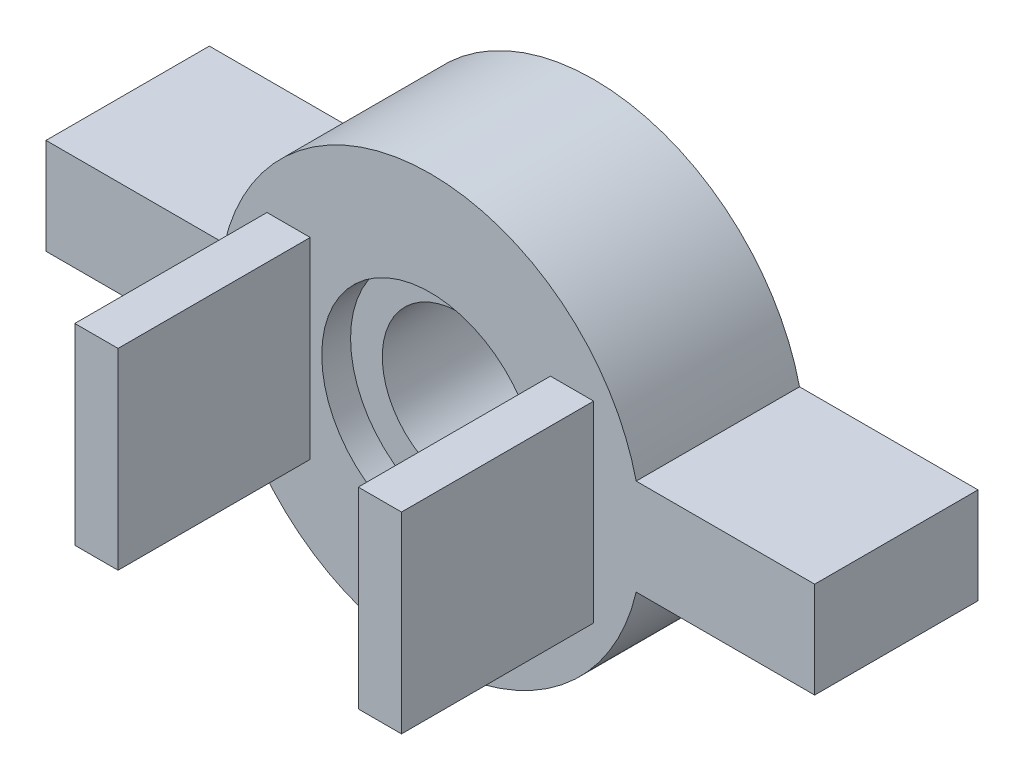
ISO-10303-21;
HEADER;
FILE_DESCRIPTION(('STEP AP214'),'2;1');
FILE_NAME('part.step','',(''),(''),'','','');
FILE_SCHEMA(('AUTOMOTIVE_DESIGN { 1 0 10303 214 1 1 1 1 }'));
ENDSEC;
DATA;
#1=APPLICATION_CONTEXT('core data for automotive mechanical design processes');
#2=APPLICATION_PROTOCOL_DEFINITION('international standard','automotive_design',2000,#1);
#3=PRODUCT_CONTEXT('',#1,'mechanical');
#4=PRODUCT('Part','Part','',(#3));
#5=PRODUCT_RELATED_PRODUCT_CATEGORY('part','',(#4));
#6=PRODUCT_DEFINITION_FORMATION('','',#4);
#7=PRODUCT_DEFINITION_CONTEXT('part definition',#1,'design');
#8=PRODUCT_DEFINITION('design','',#6,#7);
#9=PRODUCT_DEFINITION_SHAPE('','',#8);
#10=(LENGTH_UNIT() NAMED_UNIT(*) SI_UNIT(.MILLI.,.METRE.));
#11=(NAMED_UNIT(*) PLANE_ANGLE_UNIT() SI_UNIT($,.RADIAN.));
#12=(NAMED_UNIT(*) SI_UNIT($,.STERADIAN.) SOLID_ANGLE_UNIT());
#13=UNCERTAINTY_MEASURE_WITH_UNIT(LENGTH_MEASURE(1.E-05),#10,'distance_accuracy_value','');
#14=(GEOMETRIC_REPRESENTATION_CONTEXT(3) GLOBAL_UNCERTAINTY_ASSIGNED_CONTEXT((#13)) GLOBAL_UNIT_ASSIGNED_CONTEXT((#10,
#11,#12)) REPRESENTATION_CONTEXT('',''));
#15=CARTESIAN_POINT('',(0.,0.,0.));
#16=DIRECTION('',(0.,0.,1.));
#17=DIRECTION('',(1.,0.,0.));
#18=AXIS2_PLACEMENT_3D('',#15,#16,#17);
#19=CARTESIAN_POINT('',(0.,0.,-0.000999999999999265));
#20=DIRECTION('',(0.,0.,1.));
#21=DIRECTION('',(1.,0.,0.));
#22=AXIS2_PLACEMENT_3D('',#19,#20,#21);
#23=CYLINDRICAL_SURFACE('',#22,4.);
#24=CARTESIAN_POINT('',(0.,0.,0.));
#25=DIRECTION('',(0.,0.,1.));
#26=DIRECTION('',(1.,0.,0.));
#27=AXIS2_PLACEMENT_3D('',#24,#25,#26);
#28=CIRCLE('',#27,4.);
#29=CARTESIAN_POINT('',(4.,0.,0.));
#30=VERTEX_POINT('',#29);
#31=EDGE_CURVE('E204',#30,#30,#28,.F.);
#32=ORIENTED_EDGE('',*,*,#31,.T.);
#33=EDGE_LOOP('',(#32));
#34=FACE_BOUND('',#33,.T.);
#35=CARTESIAN_POINT('',(0.,0.,7.));
#36=DIRECTION('',(0.,0.,1.));
#37=DIRECTION('',(1.,0.,0.));
#38=AXIS2_PLACEMENT_3D('',#35,#36,#37);
#39=CIRCLE('',#38,4.);
#40=CARTESIAN_POINT('',(4.,0.,7.));
#41=VERTEX_POINT('',#40);
#42=EDGE_CURVE('E37',#41,#41,#39,.F.);
#43=ORIENTED_EDGE('',*,*,#42,.F.);
#44=EDGE_LOOP('',(#43));
#45=FACE_BOUND('',#44,.T.);
#46=ADVANCED_FACE('F33',(#34,#45),#23,.F.);
#47=CARTESIAN_POINT('',(0.,0.,8.5));
#48=DIRECTION('',(0.,0.,1.));
#49=DIRECTION('',(1.,0.,0.));
#50=AXIS2_PLACEMENT_3D('',#47,#48,#49);
#51=PLANE('',#50);
#52=CARTESIAN_POINT('',(0.,0.,8.5));
#53=DIRECTION('',(0.,0.,1.));
#54=DIRECTION('',(1.,0.,0.));
#55=AXIS2_PLACEMENT_3D('',#52,#53,#54);
#56=CIRCLE('',#55,5.65);
#57=CARTESIAN_POINT('',(5.65,0.,8.5));
#58=VERTEX_POINT('',#57);
#59=EDGE_CURVE('E510',#58,#58,#56,.T.);
#60=ORIENTED_EDGE('',*,*,#59,.F.);
#61=EDGE_LOOP('',(#60));
#62=FACE_BOUND('',#61,.T.);
#63=CARTESIAN_POINT('',(0.,0.,8.5));
#64=DIRECTION('',(0.,0.,1.));
#65=DIRECTION('',(1.,0.,0.));
#66=AXIS2_PLACEMENT_3D('',#63,#64,#65);
#67=CIRCLE('',#66,11.);
#68=CARTESIAN_POINT('',(10.7121426428143,2.5,8.5));
#69=VERTEX_POINT('',#68);
#70=CARTESIAN_POINT('',(-10.7121426428143,2.5,8.5));
#71=VERTEX_POINT('',#70);
#72=EDGE_CURVE('E208',#69,#71,#67,.T.);
#73=ORIENTED_EDGE('',*,*,#72,.T.);
#74=DIRECTION('',(-1.,0.,0.));
#75=VECTOR('',#74,1.);
#76=CARTESIAN_POINT('',(-20.,2.5,8.5));
#77=LINE('',#76,#75);
#78=CARTESIAN_POINT('',(-20.,2.5,8.5));
#79=VERTEX_POINT('',#78);
#80=EDGE_CURVE('E211',#71,#79,#77,.T.);
#81=ORIENTED_EDGE('',*,*,#80,.T.);
#82=DIRECTION('',(0.,-1.,0.));
#83=VECTOR('',#82,1.);
#84=CARTESIAN_POINT('',(-20.,2.5,8.5));
#85=LINE('',#84,#83);
#86=CARTESIAN_POINT('',(-20.,-2.5,8.5));
#87=VERTEX_POINT('',#86);
#88=EDGE_CURVE('E214',#79,#87,#85,.T.);
#89=ORIENTED_EDGE('',*,*,#88,.T.);
#90=DIRECTION('',(1.,0.,0.));
#91=VECTOR('',#90,1.);
#92=CARTESIAN_POINT('',(-20.,-2.5,8.5));
#93=LINE('',#92,#91);
#94=CARTESIAN_POINT('',(-10.7121426428143,-2.5,8.5));
#95=VERTEX_POINT('',#94);
#96=EDGE_CURVE('E216',#87,#95,#93,.T.);
#97=ORIENTED_EDGE('',*,*,#96,.T.);
#98=CARTESIAN_POINT('',(0.,0.,8.5));
#99=DIRECTION('',(0.,0.,1.));
#100=DIRECTION('',(1.,0.,0.));
#101=AXIS2_PLACEMENT_3D('',#98,#99,#100);
#102=CIRCLE('',#101,11.);
#103=CARTESIAN_POINT('',(10.7121426428143,-2.50000000000001,8.5));
#104=VERTEX_POINT('',#103);
#105=EDGE_CURVE('E218',#95,#104,#102,.T.);
#106=ORIENTED_EDGE('',*,*,#105,.T.);
#107=DIRECTION('',(1.,0.,0.));
#108=VECTOR('',#107,1.);
#109=CARTESIAN_POINT('',(10.7121426428143,-2.5,8.5));
#110=LINE('',#109,#108);
#111=CARTESIAN_POINT('',(20.,-2.5,8.5));
#112=VERTEX_POINT('',#111);
#113=EDGE_CURVE('E220',#104,#112,#110,.T.);
#114=ORIENTED_EDGE('',*,*,#113,.T.);
#115=DIRECTION('',(0.,1.,0.));
#116=VECTOR('',#115,1.);
#117=CARTESIAN_POINT('',(20.,2.5,8.5));
#118=LINE('',#117,#116);
#119=CARTESIAN_POINT('',(20.,2.5,8.5));
#120=VERTEX_POINT('',#119);
#121=EDGE_CURVE('E222',#112,#120,#118,.T.);
#122=ORIENTED_EDGE('',*,*,#121,.T.);
#123=DIRECTION('',(-1.,0.,0.));
#124=VECTOR('',#123,1.);
#125=CARTESIAN_POINT('',(10.7121426428143,2.5,8.5));
#126=LINE('',#125,#124);
#127=EDGE_CURVE('E224',#120,#69,#126,.T.);
#128=ORIENTED_EDGE('',*,*,#127,.T.);
#129=EDGE_LOOP('',(#73,#81,#89,#97,#106,#114,#122,#128));
#130=FACE_BOUND('',#129,.T.);
#131=DIRECTION('',(1.,0.,0.));
#132=VECTOR('',#131,1.);
#133=CARTESIAN_POINT('',(6.25,-5.,8.5));
#134=LINE('',#133,#132);
#135=CARTESIAN_POINT('',(6.25,-5.,8.5));
#136=VERTEX_POINT('',#135);
#137=CARTESIAN_POINT('',(8.5,-5.,8.5));
#138=VERTEX_POINT('',#137);
#139=EDGE_CURVE('E176',#136,#138,#134,.T.);
#140=ORIENTED_EDGE('',*,*,#139,.F.);
#141=DIRECTION('',(0.,-1.,0.));
#142=VECTOR('',#141,1.);
#143=CARTESIAN_POINT('',(6.25,-5.,8.5));
#144=LINE('',#143,#142);
#145=CARTESIAN_POINT('',(6.25,5.,8.5));
#146=VERTEX_POINT('',#145);
#147=EDGE_CURVE('E173',#146,#136,#144,.T.);
#148=ORIENTED_EDGE('',*,*,#147,.F.);
#149=DIRECTION('',(-1.,0.,0.));
#150=VECTOR('',#149,1.);
#151=CARTESIAN_POINT('',(6.25,5.,8.5));
#152=LINE('',#151,#150);
#153=CARTESIAN_POINT('',(8.5,5.,8.5));
#154=VERTEX_POINT('',#153);
#155=EDGE_CURVE('E185',#154,#146,#152,.T.);
#156=ORIENTED_EDGE('',*,*,#155,.F.);
#157=DIRECTION('',(0.,1.,0.));
#158=VECTOR('',#157,1.);
#159=CARTESIAN_POINT('',(8.5,5.,8.5));
#160=LINE('',#159,#158);
#161=EDGE_CURVE('E193',#138,#154,#160,.T.);
#162=ORIENTED_EDGE('',*,*,#161,.F.);
#163=EDGE_LOOP('',(#140,#148,#156,#162));
#164=FACE_BOUND('',#163,.T.);
#165=DIRECTION('',(0.,1.,0.));
#166=VECTOR('',#165,1.);
#167=CARTESIAN_POINT('',(-6.25,-5.,8.5));
#168=LINE('',#167,#166);
#169=CARTESIAN_POINT('',(-6.25,-5.,8.5));
#170=VERTEX_POINT('',#169);
#171=CARTESIAN_POINT('',(-6.25,5.,8.5));
#172=VERTEX_POINT('',#171);
#173=EDGE_CURVE('E518',#170,#172,#168,.T.);
#174=ORIENTED_EDGE('',*,*,#173,.F.);
#175=DIRECTION('',(1.,0.,0.));
#176=VECTOR('',#175,1.);
#177=CARTESIAN_POINT('',(-8.5,-5.,8.5));
#178=LINE('',#177,#176);
#179=CARTESIAN_POINT('',(-8.5,-5.,8.5));
#180=VERTEX_POINT('',#179);
#181=EDGE_CURVE('E171',#180,#170,#178,.T.);
#182=ORIENTED_EDGE('',*,*,#181,.F.);
#183=DIRECTION('',(0.,-1.,0.));
#184=VECTOR('',#183,1.);
#185=CARTESIAN_POINT('',(-8.5,5.,8.5));
#186=LINE('',#185,#184);
#187=CARTESIAN_POINT('',(-8.5,5.,8.5));
#188=VERTEX_POINT('',#187);
#189=EDGE_CURVE('E167',#188,#180,#186,.T.);
#190=ORIENTED_EDGE('',*,*,#189,.F.);
#191=DIRECTION('',(-1.,0.,0.));
#192=VECTOR('',#191,1.);
#193=CARTESIAN_POINT('',(-8.5,5.,8.5));
#194=LINE('',#193,#192);
#195=EDGE_CURVE('E520',#172,#188,#194,.T.);
#196=ORIENTED_EDGE('',*,*,#195,.F.);
#197=EDGE_LOOP('',(#174,#182,#190,#196));
#198=FACE_BOUND('',#197,.T.);
#199=ADVANCED_FACE('F283',(#62,#130,#164,#198),#51,.T.);
#200=CARTESIAN_POINT('',(0.,0.,8.5));
#201=DIRECTION('',(0.,0.,-1.));
#202=DIRECTION('',(-1.,0.,0.));
#203=AXIS2_PLACEMENT_3D('',#200,#201,#202);
#204=CYLINDRICAL_SURFACE('',#203,11.);
#205=CARTESIAN_POINT('',(0.,0.,0.));
#206=DIRECTION('',(0.,0.,1.));
#207=DIRECTION('',(1.,0.,0.));
#208=AXIS2_PLACEMENT_3D('',#205,#206,#207);
#209=CIRCLE('',#208,11.);
#210=CARTESIAN_POINT('',(10.7121426428143,2.5,0.));
#211=VERTEX_POINT('',#210);
#212=CARTESIAN_POINT('',(-10.7121426428143,2.5,0.));
#213=VERTEX_POINT('',#212);
#214=EDGE_CURVE('E207',#211,#213,#209,.T.);
#215=ORIENTED_EDGE('',*,*,#214,.T.);
#216=DIRECTION('',(0.,0.,-1.));
#217=VECTOR('',#216,1.);
#218=CARTESIAN_POINT('',(-10.7121426428143,2.5,8.5));
#219=LINE('',#218,#217);
#220=EDGE_CURVE('E11',#71,#213,#219,.T.);
#221=ORIENTED_EDGE('',*,*,#220,.F.);
#222=ORIENTED_EDGE('',*,*,#72,.F.);
#223=DIRECTION('',(0.,0.,-1.));
#224=VECTOR('',#223,1.);
#225=CARTESIAN_POINT('',(10.7121426428143,2.5,8.5));
#226=LINE('',#225,#224);
#227=EDGE_CURVE('E226',#69,#211,#226,.T.);
#228=ORIENTED_EDGE('',*,*,#227,.T.);
#229=EDGE_LOOP('',(#215,#221,#222,#228));
#230=FACE_BOUND('',#229,.T.);
#231=ADVANCED_FACE('F35',(#230),#204,.T.);
#232=CARTESIAN_POINT('',(-20.,2.5,8.5));
#233=DIRECTION('',(0.,-1.,0.));
#234=DIRECTION('',(0.,0.,-1.));
#235=AXIS2_PLACEMENT_3D('',#232,#233,#234);
#236=PLANE('',#235);
#237=DIRECTION('',(-1.,0.,0.));
#238=VECTOR('',#237,1.);
#239=CARTESIAN_POINT('',(-20.,2.5,0.));
#240=LINE('',#239,#238);
#241=CARTESIAN_POINT('',(-20.,2.5,0.));
#242=VERTEX_POINT('',#241);
#243=EDGE_CURVE('E229',#213,#242,#240,.T.);
#244=ORIENTED_EDGE('',*,*,#243,.T.);
#245=DIRECTION('',(0.,0.,-1.));
#246=VECTOR('',#245,1.);
#247=CARTESIAN_POINT('',(-20.,2.5,8.5));
#248=LINE('',#247,#246);
#249=EDGE_CURVE('E42',#79,#242,#248,.T.);
#250=ORIENTED_EDGE('',*,*,#249,.F.);
#251=ORIENTED_EDGE('',*,*,#80,.F.);
#252=ORIENTED_EDGE('',*,*,#220,.T.);
#253=EDGE_LOOP('',(#244,#250,#251,#252));
#254=FACE_BOUND('',#253,.T.);
#255=ADVANCED_FACE('F288',(#254),#236,.F.);
#256=CARTESIAN_POINT('',(-20.,2.5,8.5));
#257=DIRECTION('',(1.,0.,0.));
#258=DIRECTION('',(0.,0.,-1.));
#259=AXIS2_PLACEMENT_3D('',#256,#257,#258);
#260=PLANE('',#259);
#261=DIRECTION('',(0.,-1.,0.));
#262=VECTOR('',#261,1.);
#263=CARTESIAN_POINT('',(-20.,2.5,0.));
#264=LINE('',#263,#262);
#265=CARTESIAN_POINT('',(-20.,-2.5,0.));
#266=VERTEX_POINT('',#265);
#267=EDGE_CURVE('E231',#242,#266,#264,.T.);
#268=ORIENTED_EDGE('',*,*,#267,.T.);
#269=DIRECTION('',(0.,0.,-1.));
#270=VECTOR('',#269,1.);
#271=CARTESIAN_POINT('',(-20.,-2.5,8.5));
#272=LINE('',#271,#270);
#273=EDGE_CURVE('E256',#87,#266,#272,.T.);
#274=ORIENTED_EDGE('',*,*,#273,.F.);
#275=ORIENTED_EDGE('',*,*,#88,.F.);
#276=ORIENTED_EDGE('',*,*,#249,.T.);
#277=EDGE_LOOP('',(#268,#274,#275,#276));
#278=FACE_BOUND('',#277,.T.);
#279=ADVANCED_FACE('F264',(#278),#260,.F.);
#280=CARTESIAN_POINT('',(-20.,-2.5,8.5));
#281=DIRECTION('',(0.,1.,0.));
#282=DIRECTION('',(0.,0.,1.));
#283=AXIS2_PLACEMENT_3D('',#280,#281,#282);
#284=PLANE('',#283);
#285=DIRECTION('',(1.,0.,0.));
#286=VECTOR('',#285,1.);
#287=CARTESIAN_POINT('',(-20.,-2.5,0.));
#288=LINE('',#287,#286);
#289=CARTESIAN_POINT('',(-10.7121426428143,-2.5,0.));
#290=VERTEX_POINT('',#289);
#291=EDGE_CURVE('E233',#266,#290,#288,.T.);
#292=ORIENTED_EDGE('',*,*,#291,.T.);
#293=DIRECTION('',(0.,0.,-1.));
#294=VECTOR('',#293,1.);
#295=CARTESIAN_POINT('',(-10.7121426428143,-2.5,8.5));
#296=LINE('',#295,#294);
#297=EDGE_CURVE('E253',#95,#290,#296,.T.);
#298=ORIENTED_EDGE('',*,*,#297,.F.);
#299=ORIENTED_EDGE('',*,*,#96,.F.);
#300=ORIENTED_EDGE('',*,*,#273,.T.);
#301=EDGE_LOOP('',(#292,#298,#299,#300));
#302=FACE_BOUND('',#301,.T.);
#303=ADVANCED_FACE('F275',(#302),#284,.F.);
#304=CARTESIAN_POINT('',(0.,0.,8.5));
#305=DIRECTION('',(0.,0.,-1.));
#306=DIRECTION('',(-1.,0.,0.));
#307=AXIS2_PLACEMENT_3D('',#304,#305,#306);
#308=CYLINDRICAL_SURFACE('',#307,11.);
#309=CARTESIAN_POINT('',(0.,0.,0.));
#310=DIRECTION('',(0.,0.,1.));
#311=DIRECTION('',(1.,0.,0.));
#312=AXIS2_PLACEMENT_3D('',#309,#310,#311);
#313=CIRCLE('',#312,11.);
#314=CARTESIAN_POINT('',(10.7121426428143,-2.50000000000001,0.));
#315=VERTEX_POINT('',#314);
#316=EDGE_CURVE('E235',#290,#315,#313,.T.);
#317=ORIENTED_EDGE('',*,*,#316,.T.);
#318=DIRECTION('',(0.,0.,-1.));
#319=VECTOR('',#318,1.);
#320=CARTESIAN_POINT('',(10.7121426428143,-2.50000000000001,8.5));
#321=LINE('',#320,#319);
#322=EDGE_CURVE('E250',#104,#315,#321,.T.);
#323=ORIENTED_EDGE('',*,*,#322,.F.);
#324=ORIENTED_EDGE('',*,*,#105,.F.);
#325=ORIENTED_EDGE('',*,*,#297,.T.);
#326=EDGE_LOOP('',(#317,#323,#324,#325));
#327=FACE_BOUND('',#326,.T.);
#328=ADVANCED_FACE('F279',(#327),#308,.T.);
#329=CARTESIAN_POINT('',(10.7121426428143,-2.5,8.5));
#330=DIRECTION('',(0.,1.,0.));
#331=DIRECTION('',(0.,0.,1.));
#332=AXIS2_PLACEMENT_3D('',#329,#330,#331);
#333=PLANE('',#332);
#334=DIRECTION('',(1.,0.,0.));
#335=VECTOR('',#334,1.);
#336=CARTESIAN_POINT('',(10.7121426428143,-2.5,0.));
#337=LINE('',#336,#335);
#338=CARTESIAN_POINT('',(20.,-2.5,0.));
#339=VERTEX_POINT('',#338);
#340=EDGE_CURVE('E237',#315,#339,#337,.T.);
#341=ORIENTED_EDGE('',*,*,#340,.T.);
#342=DIRECTION('',(0.,0.,-1.));
#343=VECTOR('',#342,1.);
#344=CARTESIAN_POINT('',(20.,-2.5,8.5));
#345=LINE('',#344,#343);
#346=EDGE_CURVE('E247',#112,#339,#345,.T.);
#347=ORIENTED_EDGE('',*,*,#346,.F.);
#348=ORIENTED_EDGE('',*,*,#113,.F.);
#349=ORIENTED_EDGE('',*,*,#322,.T.);
#350=EDGE_LOOP('',(#341,#347,#348,#349));
#351=FACE_BOUND('',#350,.T.);
#352=ADVANCED_FACE('F301',(#351),#333,.F.);
#353=CARTESIAN_POINT('',(20.,2.5,8.5));
#354=DIRECTION('',(-1.,0.,0.));
#355=DIRECTION('',(0.,0.,1.));
#356=AXIS2_PLACEMENT_3D('',#353,#354,#355);
#357=PLANE('',#356);
#358=DIRECTION('',(0.,1.,0.));
#359=VECTOR('',#358,1.);
#360=CARTESIAN_POINT('',(20.,2.5,0.));
#361=LINE('',#360,#359);
#362=CARTESIAN_POINT('',(20.,2.5,0.));
#363=VERTEX_POINT('',#362);
#364=EDGE_CURVE('E239',#339,#363,#361,.T.);
#365=ORIENTED_EDGE('',*,*,#364,.T.);
#366=DIRECTION('',(0.,0.,-1.));
#367=VECTOR('',#366,1.);
#368=CARTESIAN_POINT('',(20.,2.5,8.5));
#369=LINE('',#368,#367);
#370=EDGE_CURVE('E244',#120,#363,#369,.T.);
#371=ORIENTED_EDGE('',*,*,#370,.F.);
#372=ORIENTED_EDGE('',*,*,#121,.F.);
#373=ORIENTED_EDGE('',*,*,#346,.T.);
#374=EDGE_LOOP('',(#365,#371,#372,#373));
#375=FACE_BOUND('',#374,.T.);
#376=ADVANCED_FACE('F299',(#375),#357,.F.);
#377=CARTESIAN_POINT('',(10.7121426428143,2.5,8.5));
#378=DIRECTION('',(0.,-1.,0.));
#379=DIRECTION('',(0.,0.,-1.));
#380=AXIS2_PLACEMENT_3D('',#377,#378,#379);
#381=PLANE('',#380);
#382=DIRECTION('',(-1.,0.,0.));
#383=VECTOR('',#382,1.);
#384=CARTESIAN_POINT('',(10.7121426428143,2.5,0.));
#385=LINE('',#384,#383);
#386=EDGE_CURVE('E212',#363,#211,#385,.T.);
#387=ORIENTED_EDGE('',*,*,#386,.T.);
#388=ORIENTED_EDGE('',*,*,#227,.F.);
#389=ORIENTED_EDGE('',*,*,#127,.F.);
#390=ORIENTED_EDGE('',*,*,#370,.T.);
#391=EDGE_LOOP('',(#387,#388,#389,#390));
#392=FACE_BOUND('',#391,.T.);
#393=ADVANCED_FACE('F294',(#392),#381,.F.);
#394=CARTESIAN_POINT('',(0.,0.,0.));
#395=DIRECTION('',(0.,0.,1.));
#396=DIRECTION('',(1.,0.,0.));
#397=AXIS2_PLACEMENT_3D('',#394,#395,#396);
#398=PLANE('',#397);
#399=ORIENTED_EDGE('',*,*,#31,.F.);
#400=EDGE_LOOP('',(#399));
#401=FACE_BOUND('',#400,.T.);
#402=ORIENTED_EDGE('',*,*,#214,.F.);
#403=ORIENTED_EDGE('',*,*,#386,.F.);
#404=ORIENTED_EDGE('',*,*,#364,.F.);
#405=ORIENTED_EDGE('',*,*,#340,.F.);
#406=ORIENTED_EDGE('',*,*,#316,.F.);
#407=ORIENTED_EDGE('',*,*,#291,.F.);
#408=ORIENTED_EDGE('',*,*,#267,.F.);
#409=ORIENTED_EDGE('',*,*,#243,.F.);
#410=EDGE_LOOP('',(#402,#403,#404,#405,#406,#407,#408,#409));
#411=FACE_BOUND('',#410,.T.);
#412=ADVANCED_FACE('F270',(#401,#411),#398,.F.);
#413=CARTESIAN_POINT('',(6.25,-5.,18.5));
#414=DIRECTION('',(1.,0.,0.));
#415=DIRECTION('',(0.,0.,-1.));
#416=AXIS2_PLACEMENT_3D('',#413,#414,#415);
#417=PLANE('',#416);
#418=ORIENTED_EDGE('',*,*,#147,.T.);
#419=DIRECTION('',(0.,0.,-1.));
#420=VECTOR('',#419,1.);
#421=CARTESIAN_POINT('',(6.25,-5.,18.5));
#422=LINE('',#421,#420);
#423=CARTESIAN_POINT('',(6.25,-5.,18.5));
#424=VERTEX_POINT('',#423);
#425=EDGE_CURVE('E202',#424,#136,#422,.T.);
#426=ORIENTED_EDGE('',*,*,#425,.F.);
#427=DIRECTION('',(0.,-1.,0.));
#428=VECTOR('',#427,1.);
#429=CARTESIAN_POINT('',(6.25,-5.,18.5));
#430=LINE('',#429,#428);
#431=CARTESIAN_POINT('',(6.25,5.,18.5));
#432=VERTEX_POINT('',#431);
#433=EDGE_CURVE('E181',#432,#424,#430,.T.);
#434=ORIENTED_EDGE('',*,*,#433,.F.);
#435=DIRECTION('',(0.,0.,-1.));
#436=VECTOR('',#435,1.);
#437=CARTESIAN_POINT('',(6.25,5.,18.5));
#438=LINE('',#437,#436);
#439=EDGE_CURVE('E190',#432,#146,#438,.T.);
#440=ORIENTED_EDGE('',*,*,#439,.T.);
#441=EDGE_LOOP('',(#418,#426,#434,#440));
#442=FACE_BOUND('',#441,.T.);
#443=ADVANCED_FACE('F320',(#442),#417,.F.);
#444=CARTESIAN_POINT('',(6.25,-5.,18.5));
#445=DIRECTION('',(0.,1.,0.));
#446=DIRECTION('',(0.,0.,1.));
#447=AXIS2_PLACEMENT_3D('',#444,#445,#446);
#448=PLANE('',#447);
#449=ORIENTED_EDGE('',*,*,#139,.T.);
#450=DIRECTION('',(0.,0.,-1.));
#451=VECTOR('',#450,1.);
#452=CARTESIAN_POINT('',(8.5,-5.,18.5));
#453=LINE('',#452,#451);
#454=CARTESIAN_POINT('',(8.5,-5.,18.5));
#455=VERTEX_POINT('',#454);
#456=EDGE_CURVE('E199',#455,#138,#453,.T.);
#457=ORIENTED_EDGE('',*,*,#456,.F.);
#458=DIRECTION('',(1.,0.,0.));
#459=VECTOR('',#458,1.);
#460=CARTESIAN_POINT('',(6.25,-5.,18.5));
#461=LINE('',#460,#459);
#462=EDGE_CURVE('E184',#424,#455,#461,.T.);
#463=ORIENTED_EDGE('',*,*,#462,.F.);
#464=ORIENTED_EDGE('',*,*,#425,.T.);
#465=EDGE_LOOP('',(#449,#457,#463,#464));
#466=FACE_BOUND('',#465,.T.);
#467=ADVANCED_FACE('F341',(#466),#448,.F.);
#468=CARTESIAN_POINT('',(8.5,5.,18.5));
#469=DIRECTION('',(-1.,0.,0.));
#470=DIRECTION('',(0.,0.,1.));
#471=AXIS2_PLACEMENT_3D('',#468,#469,#470);
#472=PLANE('',#471);
#473=ORIENTED_EDGE('',*,*,#161,.T.);
#474=DIRECTION('',(0.,0.,-1.));
#475=VECTOR('',#474,1.);
#476=CARTESIAN_POINT('',(8.5,5.,18.5));
#477=LINE('',#476,#475);
#478=CARTESIAN_POINT('',(8.5,5.,18.5));
#479=VERTEX_POINT('',#478);
#480=EDGE_CURVE('E57',#479,#154,#477,.T.);
#481=ORIENTED_EDGE('',*,*,#480,.F.);
#482=DIRECTION('',(0.,1.,0.));
#483=VECTOR('',#482,1.);
#484=CARTESIAN_POINT('',(8.5,5.,18.5));
#485=LINE('',#484,#483);
#486=EDGE_CURVE('E187',#455,#479,#485,.T.);
#487=ORIENTED_EDGE('',*,*,#486,.F.);
#488=ORIENTED_EDGE('',*,*,#456,.T.);
#489=EDGE_LOOP('',(#473,#481,#487,#488));
#490=FACE_BOUND('',#489,.T.);
#491=ADVANCED_FACE('F348',(#490),#472,.F.);
#492=CARTESIAN_POINT('',(6.25,5.,18.5));
#493=DIRECTION('',(0.,-1.,0.));
#494=DIRECTION('',(0.,0.,-1.));
#495=AXIS2_PLACEMENT_3D('',#492,#493,#494);
#496=PLANE('',#495);
#497=ORIENTED_EDGE('',*,*,#155,.T.);
#498=ORIENTED_EDGE('',*,*,#439,.F.);
#499=DIRECTION('',(-1.,0.,0.));
#500=VECTOR('',#499,1.);
#501=CARTESIAN_POINT('',(6.25,5.,18.5));
#502=LINE('',#501,#500);
#503=EDGE_CURVE('E189',#479,#432,#502,.T.);
#504=ORIENTED_EDGE('',*,*,#503,.F.);
#505=ORIENTED_EDGE('',*,*,#480,.T.);
#506=EDGE_LOOP('',(#497,#498,#504,#505));
#507=FACE_BOUND('',#506,.T.);
#508=ADVANCED_FACE('F355',(#507),#496,.F.);
#509=CARTESIAN_POINT('',(0.,0.,18.5));
#510=DIRECTION('',(0.,0.,-1.));
#511=DIRECTION('',(-1.,0.,0.));
#512=AXIS2_PLACEMENT_3D('',#509,#510,#511);
#513=PLANE('',#512);
#514=ORIENTED_EDGE('',*,*,#433,.T.);
#515=ORIENTED_EDGE('',*,*,#462,.T.);
#516=ORIENTED_EDGE('',*,*,#486,.T.);
#517=ORIENTED_EDGE('',*,*,#503,.T.);
#518=EDGE_LOOP('',(#514,#515,#516,#517));
#519=FACE_BOUND('',#518,.T.);
#520=ADVANCED_FACE('F363',(#519),#513,.F.);
#521=CARTESIAN_POINT('',(-8.5,-5.,18.5));
#522=DIRECTION('',(0.,1.,0.));
#523=DIRECTION('',(0.,0.,1.));
#524=AXIS2_PLACEMENT_3D('',#521,#522,#523);
#525=PLANE('',#524);
#526=ORIENTED_EDGE('',*,*,#181,.T.);
#527=DIRECTION('',(0.,0.,-1.));
#528=VECTOR('',#527,1.);
#529=CARTESIAN_POINT('',(-6.25,-5.,18.5));
#530=LINE('',#529,#528);
#531=CARTESIAN_POINT('',(-6.25,-5.,18.5));
#532=VERTEX_POINT('',#531);
#533=EDGE_CURVE('E152',#532,#170,#530,.T.);
#534=ORIENTED_EDGE('',*,*,#533,.F.);
#535=DIRECTION('',(1.,0.,0.));
#536=VECTOR('',#535,1.);
#537=CARTESIAN_POINT('',(-8.5,-5.,18.5));
#538=LINE('',#537,#536);
#539=CARTESIAN_POINT('',(-8.5,-5.,18.5));
#540=VERTEX_POINT('',#539);
#541=EDGE_CURVE('E159',#540,#532,#538,.T.);
#542=ORIENTED_EDGE('',*,*,#541,.F.);
#543=DIRECTION('',(0.,0.,-1.));
#544=VECTOR('',#543,1.);
#545=CARTESIAN_POINT('',(-8.5,-5.,18.5));
#546=LINE('',#545,#544);
#547=EDGE_CURVE('E516',#540,#180,#546,.T.);
#548=ORIENTED_EDGE('',*,*,#547,.T.);
#549=EDGE_LOOP('',(#526,#534,#542,#548));
#550=FACE_BOUND('',#549,.T.);
#551=ADVANCED_FACE('F169',(#550),#525,.F.);
#552=CARTESIAN_POINT('',(-6.25,-5.,18.5));
#553=DIRECTION('',(-1.,0.,0.));
#554=DIRECTION('',(0.,0.,1.));
#555=AXIS2_PLACEMENT_3D('',#552,#553,#554);
#556=PLANE('',#555);
#557=ORIENTED_EDGE('',*,*,#173,.T.);
#558=DIRECTION('',(0.,0.,-1.));
#559=VECTOR('',#558,1.);
#560=CARTESIAN_POINT('',(-6.25,5.,18.5));
#561=LINE('',#560,#559);
#562=CARTESIAN_POINT('',(-6.25,5.,18.5));
#563=VERTEX_POINT('',#562);
#564=EDGE_CURVE('E155',#563,#172,#561,.T.);
#565=ORIENTED_EDGE('',*,*,#564,.F.);
#566=DIRECTION('',(0.,1.,0.));
#567=VECTOR('',#566,1.);
#568=CARTESIAN_POINT('',(-6.25,-5.,18.5));
#569=LINE('',#568,#567);
#570=EDGE_CURVE('E148',#532,#563,#569,.T.);
#571=ORIENTED_EDGE('',*,*,#570,.F.);
#572=ORIENTED_EDGE('',*,*,#533,.T.);
#573=EDGE_LOOP('',(#557,#565,#571,#572));
#574=FACE_BOUND('',#573,.T.);
#575=ADVANCED_FACE('F150',(#574),#556,.F.);
#576=CARTESIAN_POINT('',(-8.5,5.,18.5));
#577=DIRECTION('',(0.,-1.,0.));
#578=DIRECTION('',(0.,0.,-1.));
#579=AXIS2_PLACEMENT_3D('',#576,#577,#578);
#580=PLANE('',#579);
#581=ORIENTED_EDGE('',*,*,#195,.T.);
#582=DIRECTION('',(0.,0.,-1.));
#583=VECTOR('',#582,1.);
#584=CARTESIAN_POINT('',(-8.5,5.,18.5));
#585=LINE('',#584,#583);
#586=CARTESIAN_POINT('',(-8.5,5.,18.5));
#587=VERTEX_POINT('',#586);
#588=EDGE_CURVE('E49',#587,#188,#585,.T.);
#589=ORIENTED_EDGE('',*,*,#588,.F.);
#590=DIRECTION('',(-1.,0.,0.));
#591=VECTOR('',#590,1.);
#592=CARTESIAN_POINT('',(-8.5,5.,18.5));
#593=LINE('',#592,#591);
#594=EDGE_CURVE('E158',#563,#587,#593,.T.);
#595=ORIENTED_EDGE('',*,*,#594,.F.);
#596=ORIENTED_EDGE('',*,*,#564,.T.);
#597=EDGE_LOOP('',(#581,#589,#595,#596));
#598=FACE_BOUND('',#597,.T.);
#599=ADVANCED_FACE('F383',(#598),#580,.F.);
#600=CARTESIAN_POINT('',(-8.5,5.,18.5));
#601=DIRECTION('',(1.,0.,0.));
#602=DIRECTION('',(0.,0.,-1.));
#603=AXIS2_PLACEMENT_3D('',#600,#601,#602);
#604=PLANE('',#603);
#605=ORIENTED_EDGE('',*,*,#189,.T.);
#606=ORIENTED_EDGE('',*,*,#547,.F.);
#607=DIRECTION('',(0.,-1.,0.));
#608=VECTOR('',#607,1.);
#609=CARTESIAN_POINT('',(-8.5,5.,18.5));
#610=LINE('',#609,#608);
#611=EDGE_CURVE('E163',#587,#540,#610,.T.);
#612=ORIENTED_EDGE('',*,*,#611,.F.);
#613=ORIENTED_EDGE('',*,*,#588,.T.);
#614=EDGE_LOOP('',(#605,#606,#612,#613));
#615=FACE_BOUND('',#614,.T.);
#616=ADVANCED_FACE('F390',(#615),#604,.F.);
#617=CARTESIAN_POINT('',(0.,0.,18.5));
#618=DIRECTION('',(0.,0.,1.));
#619=DIRECTION('',(1.,0.,0.));
#620=AXIS2_PLACEMENT_3D('',#617,#618,#619);
#621=PLANE('',#620);
#622=ORIENTED_EDGE('',*,*,#541,.T.);
#623=ORIENTED_EDGE('',*,*,#570,.T.);
#624=ORIENTED_EDGE('',*,*,#594,.T.);
#625=ORIENTED_EDGE('',*,*,#611,.T.);
#626=EDGE_LOOP('',(#622,#623,#624,#625));
#627=FACE_BOUND('',#626,.T.);
#628=ADVANCED_FACE('F162',(#627),#621,.T.);
#629=CARTESIAN_POINT('',(0.,0.,7.));
#630=DIRECTION('',(0.,0.,1.));
#631=DIRECTION('',(1.,0.,0.));
#632=AXIS2_PLACEMENT_3D('',#629,#630,#631);
#633=PLANE('',#632);
#634=CARTESIAN_POINT('',(0.,0.,7.));
#635=DIRECTION('',(0.,0.,1.));
#636=DIRECTION('',(1.,0.,0.));
#637=AXIS2_PLACEMENT_3D('',#634,#635,#636);
#638=CIRCLE('',#637,5.65);
#639=CARTESIAN_POINT('',(5.65,0.,7.));
#640=VERTEX_POINT('',#639);
#641=EDGE_CURVE('E507',#640,#640,#638,.T.);
#642=ORIENTED_EDGE('',*,*,#641,.T.);
#643=EDGE_LOOP('',(#642));
#644=FACE_BOUND('',#643,.T.);
#645=ORIENTED_EDGE('',*,*,#42,.T.);
#646=EDGE_LOOP('',(#645));
#647=FACE_BOUND('',#646,.T.);
#648=ADVANCED_FACE('F404',(#644,#647),#633,.T.);
#649=CARTESIAN_POINT('',(0.,0.,7.));
#650=DIRECTION('',(0.,0.,1.));
#651=DIRECTION('',(1.,0.,0.));
#652=AXIS2_PLACEMENT_3D('',#649,#650,#651);
#653=CYLINDRICAL_SURFACE('',#652,5.65);
#654=ORIENTED_EDGE('',*,*,#641,.F.);
#655=EDGE_LOOP('',(#654));
#656=FACE_BOUND('',#655,.T.);
#657=ORIENTED_EDGE('',*,*,#59,.T.);
#658=EDGE_LOOP('',(#657));
#659=FACE_BOUND('',#658,.T.);
#660=ADVANCED_FACE('F411',(#656,#659),#653,.F.);
#661=CLOSED_SHELL('',(#46,#199,#231,#255,#279,#303,#328,#352,#376,#393,#412,#443,#467,#491,#508,
#520,#551,#575,#599,#616,#628,#648,#660));
#662=MANIFOLD_SOLID_BREP('B2',#661);
#663=ADVANCED_BREP_SHAPE_REPRESENTATION('',(#18,#662),#14);
#664=SHAPE_DEFINITION_REPRESENTATION(#9,#663);
ENDSEC;
END-ISO-10303-21;
